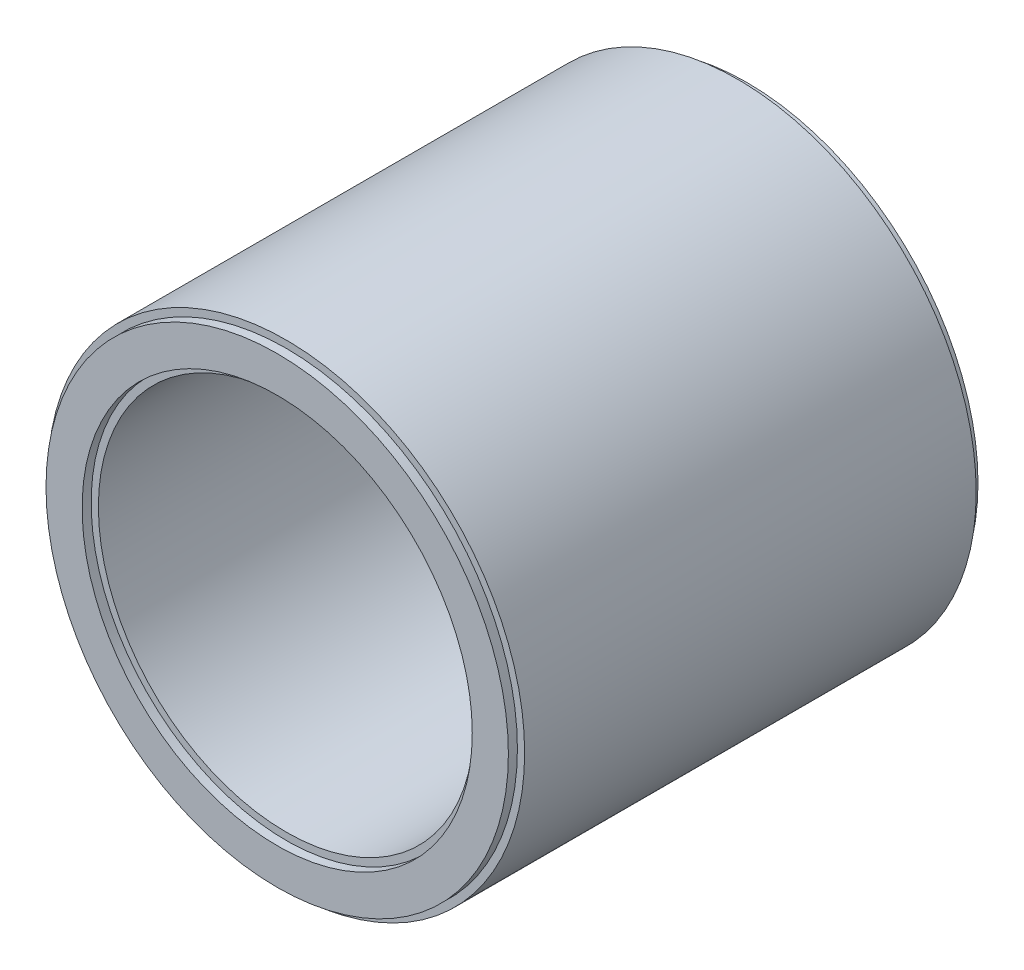
ISO-10303-21;
HEADER;
FILE_DESCRIPTION(('STEP AP214'),'2;1');
FILE_NAME('part.step','',(''),(''),'','','');
FILE_SCHEMA(('AUTOMOTIVE_DESIGN { 1 0 10303 214 1 1 1 1 }'));
ENDSEC;
DATA;
#1=APPLICATION_CONTEXT('core data for automotive mechanical design processes');
#2=APPLICATION_PROTOCOL_DEFINITION('international standard','automotive_design',2000,#1);
#3=PRODUCT_CONTEXT('',#1,'mechanical');
#4=PRODUCT('Part','Part','',(#3));
#5=PRODUCT_RELATED_PRODUCT_CATEGORY('part','',(#4));
#6=PRODUCT_DEFINITION_FORMATION('','',#4);
#7=PRODUCT_DEFINITION_CONTEXT('part definition',#1,'design');
#8=PRODUCT_DEFINITION('design','',#6,#7);
#9=PRODUCT_DEFINITION_SHAPE('','',#8);
#10=(LENGTH_UNIT() NAMED_UNIT(*) SI_UNIT(.MILLI.,.METRE.));
#11=(NAMED_UNIT(*) PLANE_ANGLE_UNIT() SI_UNIT($,.RADIAN.));
#12=(NAMED_UNIT(*) SI_UNIT($,.STERADIAN.) SOLID_ANGLE_UNIT());
#13=UNCERTAINTY_MEASURE_WITH_UNIT(LENGTH_MEASURE(1.E-05),#10,'distance_accuracy_value','');
#14=(GEOMETRIC_REPRESENTATION_CONTEXT(3) GLOBAL_UNCERTAINTY_ASSIGNED_CONTEXT((#13)) GLOBAL_UNIT_ASSIGNED_CONTEXT((#10,
#11,#12)) REPRESENTATION_CONTEXT('',''));
#15=CARTESIAN_POINT('',(0.,0.,0.));
#16=DIRECTION('',(0.,0.,1.));
#17=DIRECTION('',(1.,0.,0.));
#18=AXIS2_PLACEMENT_3D('',#15,#16,#17);
#19=CARTESIAN_POINT('',(0.,5.4,6.5));
#20=DIRECTION('',(0.,0.,-1.));
#21=DIRECTION('',(-1.,0.,0.));
#22=AXIS2_PLACEMENT_3D('',#19,#20,#21);
#23=PLANE('',#22);
#24=CARTESIAN_POINT('',(0.,0.,6.5));
#25=DIRECTION('',(0.,0.,1.));
#26=DIRECTION('',(1.,0.,0.));
#27=AXIS2_PLACEMENT_3D('',#24,#25,#26);
#28=CIRCLE('',#27,5.4);
#29=CARTESIAN_POINT('',(5.4,0.,6.5));
#30=VERTEX_POINT('',#29);
#31=EDGE_CURVE('E71',#30,#30,#28,.T.);
#32=ORIENTED_EDGE('',*,*,#31,.F.);
#33=EDGE_LOOP('',(#32));
#34=FACE_BOUND('',#33,.T.);
#35=CARTESIAN_POINT('',(0.,0.,6.5));
#36=DIRECTION('',(0.,0.,1.));
#37=DIRECTION('',(1.,0.,0.));
#38=AXIS2_PLACEMENT_3D('',#35,#36,#37);
#39=CIRCLE('',#38,6.4);
#40=CARTESIAN_POINT('',(6.4,0.,6.5));
#41=VERTEX_POINT('',#40);
#42=EDGE_CURVE('E10',#41,#41,#39,.T.);
#43=ORIENTED_EDGE('',*,*,#42,.T.);
#44=EDGE_LOOP('',(#43));
#45=FACE_BOUND('',#44,.T.);
#46=ADVANCED_FACE('F31',(#34,#45),#23,.F.);
#47=CARTESIAN_POINT('',(0.,0.,6.88356418961042));
#48=DIRECTION('',(0.,0.,1.));
#49=DIRECTION('',(1.,0.,0.));
#50=AXIS2_PLACEMENT_3D('',#47,#48,#49);
#51=CYLINDRICAL_SURFACE('',#50,6.4);
#52=ORIENTED_EDGE('',*,*,#42,.F.);
#53=EDGE_LOOP('',(#52));
#54=FACE_BOUND('',#53,.T.);
#55=CARTESIAN_POINT('',(0.,0.,6.25));
#56=DIRECTION('',(0.,0.,1.));
#57=DIRECTION('',(1.,0.,0.));
#58=AXIS2_PLACEMENT_3D('',#55,#56,#57);
#59=CIRCLE('',#58,6.4);
#60=CARTESIAN_POINT('',(6.4,0.,6.25));
#61=VERTEX_POINT('',#60);
#62=EDGE_CURVE('E37',#61,#61,#59,.T.);
#63=ORIENTED_EDGE('',*,*,#62,.T.);
#64=EDGE_LOOP('',(#63));
#65=FACE_BOUND('',#64,.T.);
#66=ADVANCED_FACE('F78',(#54,#65),#51,.T.);
#67=CARTESIAN_POINT('',(0.,6.4,6.25));
#68=DIRECTION('',(0.,0.,-1.));
#69=DIRECTION('',(-1.,0.,0.));
#70=AXIS2_PLACEMENT_3D('',#67,#68,#69);
#71=PLANE('',#70);
#72=ORIENTED_EDGE('',*,*,#62,.F.);
#73=EDGE_LOOP('',(#72));
#74=FACE_BOUND('',#73,.T.);
#75=CARTESIAN_POINT('',(0.,0.,6.25));
#76=DIRECTION('',(0.,0.,1.));
#77=DIRECTION('',(1.,0.,0.));
#78=AXIS2_PLACEMENT_3D('',#75,#76,#77);
#79=CIRCLE('',#78,6.6);
#80=CARTESIAN_POINT('',(6.6,0.,6.25));
#81=VERTEX_POINT('',#80);
#82=EDGE_CURVE('E41',#81,#81,#79,.T.);
#83=ORIENTED_EDGE('',*,*,#82,.T.);
#84=EDGE_LOOP('',(#83));
#85=FACE_BOUND('',#84,.T.);
#86=ADVANCED_FACE('F82',(#74,#85),#71,.F.);
#87=CARTESIAN_POINT('',(0.,0.,6.88356418961042));
#88=DIRECTION('',(0.,0.,1.));
#89=DIRECTION('',(1.,0.,0.));
#90=AXIS2_PLACEMENT_3D('',#87,#88,#89);
#91=CYLINDRICAL_SURFACE('',#90,6.6);
#92=ORIENTED_EDGE('',*,*,#82,.F.);
#93=EDGE_LOOP('',(#92));
#94=FACE_BOUND('',#93,.T.);
#95=CARTESIAN_POINT('',(0.,0.,-6.25));
#96=DIRECTION('',(0.,0.,1.));
#97=DIRECTION('',(1.,0.,0.));
#98=AXIS2_PLACEMENT_3D('',#95,#96,#97);
#99=CIRCLE('',#98,6.6);
#100=CARTESIAN_POINT('',(6.6,0.,-6.25));
#101=VERTEX_POINT('',#100);
#102=EDGE_CURVE('E45',#101,#101,#99,.T.);
#103=ORIENTED_EDGE('',*,*,#102,.T.);
#104=EDGE_LOOP('',(#103));
#105=FACE_BOUND('',#104,.T.);
#106=ADVANCED_FACE('F87',(#94,#105),#91,.T.);
#107=CARTESIAN_POINT('',(0.,6.6,-6.25));
#108=DIRECTION('',(0.,0.,1.));
#109=DIRECTION('',(1.,0.,0.));
#110=AXIS2_PLACEMENT_3D('',#107,#108,#109);
#111=PLANE('',#110);
#112=ORIENTED_EDGE('',*,*,#102,.F.);
#113=EDGE_LOOP('',(#112));
#114=FACE_BOUND('',#113,.T.);
#115=CARTESIAN_POINT('',(0.,0.,-6.25));
#116=DIRECTION('',(0.,0.,1.));
#117=DIRECTION('',(1.,0.,0.));
#118=AXIS2_PLACEMENT_3D('',#115,#116,#117);
#119=CIRCLE('',#118,6.4);
#120=CARTESIAN_POINT('',(6.4,0.,-6.25));
#121=VERTEX_POINT('',#120);
#122=EDGE_CURVE('E50',#121,#121,#119,.T.);
#123=ORIENTED_EDGE('',*,*,#122,.T.);
#124=EDGE_LOOP('',(#123));
#125=FACE_BOUND('',#124,.T.);
#126=ADVANCED_FACE('F93',(#114,#125),#111,.F.);
#127=CARTESIAN_POINT('',(0.,0.,6.88356418961042));
#128=DIRECTION('',(0.,0.,1.));
#129=DIRECTION('',(1.,0.,0.));
#130=AXIS2_PLACEMENT_3D('',#127,#128,#129);
#131=CYLINDRICAL_SURFACE('',#130,6.4);
#132=ORIENTED_EDGE('',*,*,#122,.F.);
#133=EDGE_LOOP('',(#132));
#134=FACE_BOUND('',#133,.T.);
#135=CARTESIAN_POINT('',(0.,0.,-6.5));
#136=DIRECTION('',(0.,0.,1.));
#137=DIRECTION('',(1.,0.,0.));
#138=AXIS2_PLACEMENT_3D('',#135,#136,#137);
#139=CIRCLE('',#138,6.4);
#140=CARTESIAN_POINT('',(6.4,0.,-6.5));
#141=VERTEX_POINT('',#140);
#142=EDGE_CURVE('E53',#141,#141,#139,.T.);
#143=ORIENTED_EDGE('',*,*,#142,.T.);
#144=EDGE_LOOP('',(#143));
#145=FACE_BOUND('',#144,.T.);
#146=ADVANCED_FACE('F97',(#134,#145),#131,.T.);
#147=CARTESIAN_POINT('',(0.,6.4,-6.5));
#148=DIRECTION('',(0.,0.,1.));
#149=DIRECTION('',(1.,0.,0.));
#150=AXIS2_PLACEMENT_3D('',#147,#148,#149);
#151=PLANE('',#150);
#152=ORIENTED_EDGE('',*,*,#142,.F.);
#153=EDGE_LOOP('',(#152));
#154=FACE_BOUND('',#153,.T.);
#155=CARTESIAN_POINT('',(0.,0.,-6.5));
#156=DIRECTION('',(0.,0.,1.));
#157=DIRECTION('',(1.,0.,0.));
#158=AXIS2_PLACEMENT_3D('',#155,#156,#157);
#159=CIRCLE('',#158,5.4);
#160=CARTESIAN_POINT('',(5.4,0.,-6.5));
#161=VERTEX_POINT('',#160);
#162=EDGE_CURVE('E56',#161,#161,#159,.T.);
#163=ORIENTED_EDGE('',*,*,#162,.T.);
#164=EDGE_LOOP('',(#163));
#165=FACE_BOUND('',#164,.T.);
#166=ADVANCED_FACE('F101',(#154,#165),#151,.F.);
#167=CARTESIAN_POINT('',(0.,0.,6.88356418961042));
#168=DIRECTION('',(0.,0.,1.));
#169=DIRECTION('',(1.,0.,0.));
#170=AXIS2_PLACEMENT_3D('',#167,#168,#169);
#171=CYLINDRICAL_SURFACE('',#170,5.4);
#172=ORIENTED_EDGE('',*,*,#162,.F.);
#173=EDGE_LOOP('',(#172));
#174=FACE_BOUND('',#173,.T.);
#175=CARTESIAN_POINT('',(0.,0.,-6.25));
#176=DIRECTION('',(0.,0.,1.));
#177=DIRECTION('',(1.,0.,0.));
#178=AXIS2_PLACEMENT_3D('',#175,#176,#177);
#179=CIRCLE('',#178,5.4);
#180=CARTESIAN_POINT('',(5.4,0.,-6.25));
#181=VERTEX_POINT('',#180);
#182=EDGE_CURVE('E59',#181,#181,#179,.T.);
#183=ORIENTED_EDGE('',*,*,#182,.T.);
#184=EDGE_LOOP('',(#183));
#185=FACE_BOUND('',#184,.T.);
#186=ADVANCED_FACE('F105',(#174,#185),#171,.F.);
#187=CARTESIAN_POINT('',(0.,5.4,-6.25));
#188=DIRECTION('',(0.,0.,1.));
#189=DIRECTION('',(1.,0.,0.));
#190=AXIS2_PLACEMENT_3D('',#187,#188,#189);
#191=PLANE('',#190);
#192=ORIENTED_EDGE('',*,*,#182,.F.);
#193=EDGE_LOOP('',(#192));
#194=FACE_BOUND('',#193,.T.);
#195=CARTESIAN_POINT('',(0.,0.,-6.25));
#196=DIRECTION('',(0.,0.,1.));
#197=DIRECTION('',(1.,0.,0.));
#198=AXIS2_PLACEMENT_3D('',#195,#196,#197);
#199=CIRCLE('',#198,5.2);
#200=CARTESIAN_POINT('',(5.2,0.,-6.25));
#201=VERTEX_POINT('',#200);
#202=EDGE_CURVE('E62',#201,#201,#199,.T.);
#203=ORIENTED_EDGE('',*,*,#202,.T.);
#204=EDGE_LOOP('',(#203));
#205=FACE_BOUND('',#204,.T.);
#206=ADVANCED_FACE('F109',(#194,#205),#191,.F.);
#207=CARTESIAN_POINT('',(0.,0.,6.88356418961042));
#208=DIRECTION('',(0.,0.,1.));
#209=DIRECTION('',(1.,0.,0.));
#210=AXIS2_PLACEMENT_3D('',#207,#208,#209);
#211=CYLINDRICAL_SURFACE('',#210,5.2);
#212=ORIENTED_EDGE('',*,*,#202,.F.);
#213=EDGE_LOOP('',(#212));
#214=FACE_BOUND('',#213,.T.);
#215=CARTESIAN_POINT('',(0.,0.,6.25));
#216=DIRECTION('',(0.,0.,1.));
#217=DIRECTION('',(1.,0.,0.));
#218=AXIS2_PLACEMENT_3D('',#215,#216,#217);
#219=CIRCLE('',#218,5.2);
#220=CARTESIAN_POINT('',(5.2,0.,6.25));
#221=VERTEX_POINT('',#220);
#222=EDGE_CURVE('E65',#221,#221,#219,.T.);
#223=ORIENTED_EDGE('',*,*,#222,.T.);
#224=EDGE_LOOP('',(#223));
#225=FACE_BOUND('',#224,.T.);
#226=ADVANCED_FACE('F113',(#214,#225),#211,.F.);
#227=CARTESIAN_POINT('',(0.,5.2,6.25));
#228=DIRECTION('',(0.,0.,-1.));
#229=DIRECTION('',(-1.,0.,0.));
#230=AXIS2_PLACEMENT_3D('',#227,#228,#229);
#231=PLANE('',#230);
#232=ORIENTED_EDGE('',*,*,#222,.F.);
#233=EDGE_LOOP('',(#232));
#234=FACE_BOUND('',#233,.T.);
#235=CARTESIAN_POINT('',(0.,0.,6.25));
#236=DIRECTION('',(0.,0.,1.));
#237=DIRECTION('',(1.,0.,0.));
#238=AXIS2_PLACEMENT_3D('',#235,#236,#237);
#239=CIRCLE('',#238,5.4);
#240=CARTESIAN_POINT('',(5.4,0.,6.25));
#241=VERTEX_POINT('',#240);
#242=EDGE_CURVE('E68',#241,#241,#239,.T.);
#243=ORIENTED_EDGE('',*,*,#242,.T.);
#244=EDGE_LOOP('',(#243));
#245=FACE_BOUND('',#244,.T.);
#246=ADVANCED_FACE('F117',(#234,#245),#231,.F.);
#247=CARTESIAN_POINT('',(0.,0.,6.88356418961042));
#248=DIRECTION('',(0.,0.,1.));
#249=DIRECTION('',(1.,0.,0.));
#250=AXIS2_PLACEMENT_3D('',#247,#248,#249);
#251=CYLINDRICAL_SURFACE('',#250,5.4);
#252=ORIENTED_EDGE('',*,*,#242,.F.);
#253=EDGE_LOOP('',(#252));
#254=FACE_BOUND('',#253,.T.);
#255=ORIENTED_EDGE('',*,*,#31,.T.);
#256=EDGE_LOOP('',(#255));
#257=FACE_BOUND('',#256,.T.);
#258=ADVANCED_FACE('F75',(#254,#257),#251,.F.);
#259=CLOSED_SHELL('',(#46,#66,#86,#106,#126,#146,#166,#186,#206,#226,#246,#258));
#260=MANIFOLD_SOLID_BREP('B2',#259);
#261=ADVANCED_BREP_SHAPE_REPRESENTATION('',(#18,#260),#14);
#262=SHAPE_DEFINITION_REPRESENTATION(#9,#261);
ENDSEC;
END-ISO-10303-21;
